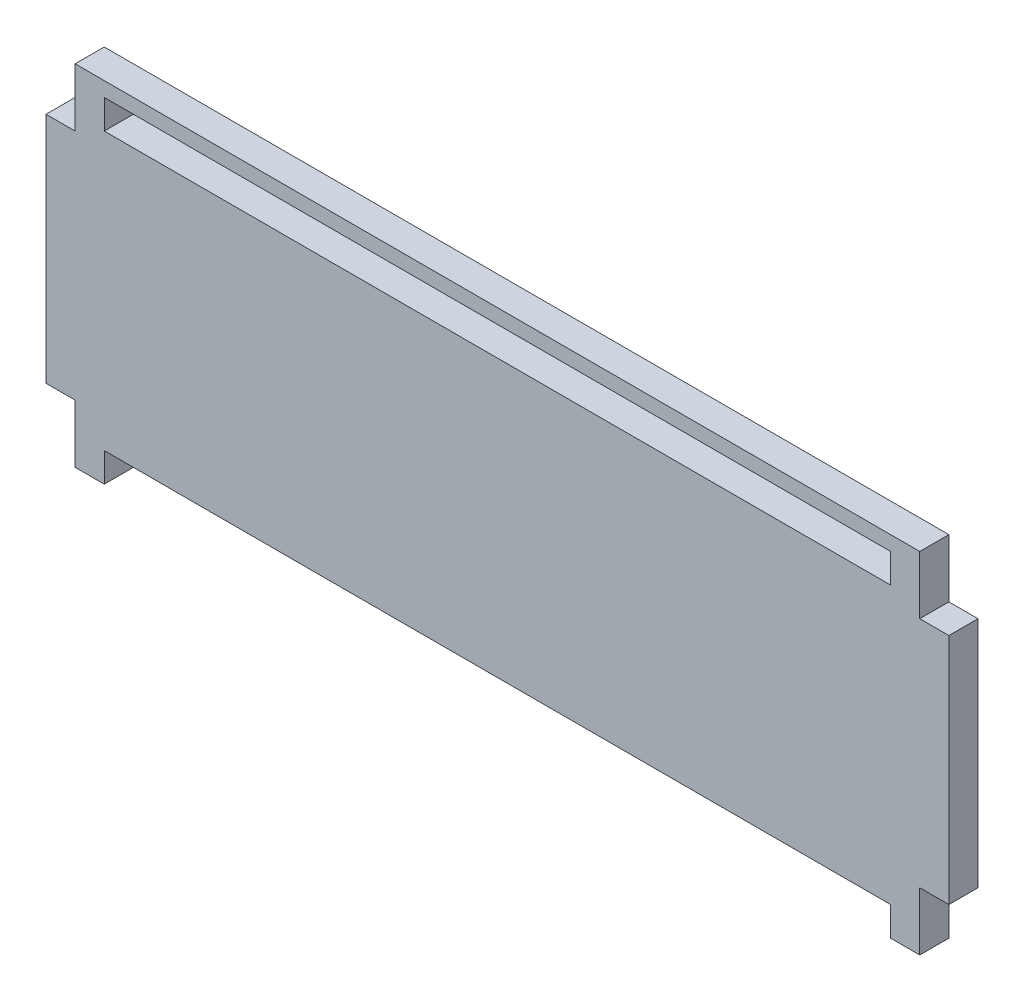
ISO-10303-21;
HEADER;
FILE_DESCRIPTION(('STEP AP214'),'2;1');
FILE_NAME('part.step','',(''),(''),'','','');
FILE_SCHEMA(('AUTOMOTIVE_DESIGN { 1 0 10303 214 1 1 1 1 }'));
ENDSEC;
DATA;
#1=APPLICATION_CONTEXT('core data for automotive mechanical design processes');
#2=APPLICATION_PROTOCOL_DEFINITION('international standard','automotive_design',2000,#1);
#3=PRODUCT_CONTEXT('',#1,'mechanical');
#4=PRODUCT('Part','Part','',(#3));
#5=PRODUCT_RELATED_PRODUCT_CATEGORY('part','',(#4));
#6=PRODUCT_DEFINITION_FORMATION('','',#4);
#7=PRODUCT_DEFINITION_CONTEXT('part definition',#1,'design');
#8=PRODUCT_DEFINITION('design','',#6,#7);
#9=PRODUCT_DEFINITION_SHAPE('','',#8);
#10=(LENGTH_UNIT() NAMED_UNIT(*) SI_UNIT(.MILLI.,.METRE.));
#11=(NAMED_UNIT(*) PLANE_ANGLE_UNIT() SI_UNIT($,.RADIAN.));
#12=(NAMED_UNIT(*) SI_UNIT($,.STERADIAN.) SOLID_ANGLE_UNIT());
#13=UNCERTAINTY_MEASURE_WITH_UNIT(LENGTH_MEASURE(1.E-05),#10,'distance_accuracy_value','');
#14=(GEOMETRIC_REPRESENTATION_CONTEXT(3) GLOBAL_UNCERTAINTY_ASSIGNED_CONTEXT((#13)) GLOBAL_UNIT_ASSIGNED_CONTEXT((#10,
#11,#12)) REPRESENTATION_CONTEXT('',''));
#15=CARTESIAN_POINT('',(0.,0.,0.));
#16=DIRECTION('',(0.,0.,1.));
#17=DIRECTION('',(1.,0.,0.));
#18=AXIS2_PLACEMENT_3D('',#15,#16,#17);
#19=CARTESIAN_POINT('',(114.3,-38.1,6.35));
#20=DIRECTION('',(0.,1.,0.));
#21=DIRECTION('',(-1.,0.,0.));
#22=AXIS2_PLACEMENT_3D('',#19,#20,#21);
#23=PLANE('',#22);
#24=DIRECTION('',(1.,0.,0.));
#25=VECTOR('',#24,1.);
#26=CARTESIAN_POINT('',(114.3,-38.1,0.));
#27=LINE('',#26,#25);
#28=CARTESIAN_POINT('',(-76.2,-38.1,0.));
#29=VERTEX_POINT('',#28);
#30=CARTESIAN_POINT('',(-69.85,-38.1,0.));
#31=VERTEX_POINT('',#30);
#32=EDGE_CURVE('E38',#29,#31,#27,.T.);
#33=ORIENTED_EDGE('',*,*,#32,.T.);
#34=DIRECTION('',(0.,0.,1.));
#35=VECTOR('',#34,1.);
#36=CARTESIAN_POINT('',(-69.85,-38.1,0.));
#37=LINE('',#36,#35);
#38=CARTESIAN_POINT('',(-69.85,-38.1,6.35));
#39=VERTEX_POINT('',#38);
#40=EDGE_CURVE('E174',#31,#39,#37,.T.);
#41=ORIENTED_EDGE('',*,*,#40,.T.);
#42=DIRECTION('',(1.,0.,0.));
#43=VECTOR('',#42,1.);
#44=CARTESIAN_POINT('',(114.3,-38.1,6.35));
#45=LINE('',#44,#43);
#46=CARTESIAN_POINT('',(-76.2,-38.1,6.35));
#47=VERTEX_POINT('',#46);
#48=EDGE_CURVE('E12',#47,#39,#45,.T.);
#49=ORIENTED_EDGE('',*,*,#48,.F.);
#50=DIRECTION('',(0.,0.,1.));
#51=VECTOR('',#50,1.);
#52=CARTESIAN_POINT('',(-76.2,-38.1,0.));
#53=LINE('',#52,#51);
#54=EDGE_CURVE('E195',#29,#47,#53,.T.);
#55=ORIENTED_EDGE('',*,*,#54,.F.);
#56=EDGE_LOOP('',(#33,#41,#49,#55));
#57=FACE_BOUND('',#56,.T.);
#58=ADVANCED_FACE('F34',(#57),#23,.F.);
#59=CARTESIAN_POINT('',(114.3,38.1,6.35));
#60=DIRECTION('',(-1.,0.,0.));
#61=DIRECTION('',(0.,-1.,0.));
#62=AXIS2_PLACEMENT_3D('',#59,#60,#61);
#63=PLANE('',#62);
#64=DIRECTION('',(0.,1.,0.));
#65=VECTOR('',#64,1.);
#66=CARTESIAN_POINT('',(114.3,38.1,6.35));
#67=LINE('',#66,#65);
#68=CARTESIAN_POINT('',(114.3,-25.4,6.35));
#69=VERTEX_POINT('',#68);
#70=CARTESIAN_POINT('',(114.3,25.4,6.35));
#71=VERTEX_POINT('',#70);
#72=EDGE_CURVE('E196',#69,#71,#67,.T.);
#73=ORIENTED_EDGE('',*,*,#72,.F.);
#74=DIRECTION('',(0.,0.,1.));
#75=VECTOR('',#74,1.);
#76=CARTESIAN_POINT('',(114.3,-25.4,0.));
#77=LINE('',#76,#75);
#78=CARTESIAN_POINT('',(114.3,-25.4,0.));
#79=VERTEX_POINT('',#78);
#80=EDGE_CURVE('E305',#79,#69,#77,.T.);
#81=ORIENTED_EDGE('',*,*,#80,.F.);
#82=DIRECTION('',(0.,1.,0.));
#83=VECTOR('',#82,1.);
#84=CARTESIAN_POINT('',(114.3,38.1,0.));
#85=LINE('',#84,#83);
#86=CARTESIAN_POINT('',(114.3,25.4,0.));
#87=VERTEX_POINT('',#86);
#88=EDGE_CURVE('E211',#79,#87,#85,.T.);
#89=ORIENTED_EDGE('',*,*,#88,.T.);
#90=DIRECTION('',(0.,0.,1.));
#91=VECTOR('',#90,1.);
#92=CARTESIAN_POINT('',(114.3,25.4,0.));
#93=LINE('',#92,#91);
#94=EDGE_CURVE('E275',#87,#71,#93,.T.);
#95=ORIENTED_EDGE('',*,*,#94,.T.);
#96=EDGE_LOOP('',(#73,#81,#89,#95));
#97=FACE_BOUND('',#96,.T.);
#98=ADVANCED_FACE('F36',(#97),#63,.F.);
#99=CARTESIAN_POINT('',(114.3,38.1,6.35));
#100=DIRECTION('',(0.,-1.,0.));
#101=DIRECTION('',(1.,0.,0.));
#102=AXIS2_PLACEMENT_3D('',#99,#100,#101);
#103=PLANE('',#102);
#104=DIRECTION('',(-1.,0.,0.));
#105=VECTOR('',#104,1.);
#106=CARTESIAN_POINT('',(114.3,38.1,6.35));
#107=LINE('',#106,#105);
#108=CARTESIAN_POINT('',(107.95,38.1,6.35));
#109=VERTEX_POINT('',#108);
#110=CARTESIAN_POINT('',(-76.2,38.1,6.35));
#111=VERTEX_POINT('',#110);
#112=EDGE_CURVE('E198',#109,#111,#107,.T.);
#113=ORIENTED_EDGE('',*,*,#112,.F.);
#114=DIRECTION('',(0.,0.,1.));
#115=VECTOR('',#114,1.);
#116=CARTESIAN_POINT('',(107.95,38.1,0.));
#117=LINE('',#116,#115);
#118=CARTESIAN_POINT('',(107.95,38.1,0.));
#119=VERTEX_POINT('',#118);
#120=EDGE_CURVE('E286',#119,#109,#117,.T.);
#121=ORIENTED_EDGE('',*,*,#120,.F.);
#122=DIRECTION('',(-1.,0.,0.));
#123=VECTOR('',#122,1.);
#124=CARTESIAN_POINT('',(114.3,38.1,0.));
#125=LINE('',#124,#123);
#126=CARTESIAN_POINT('',(-76.2,38.1,0.));
#127=VERTEX_POINT('',#126);
#128=EDGE_CURVE('E206',#119,#127,#125,.T.);
#129=ORIENTED_EDGE('',*,*,#128,.T.);
#130=DIRECTION('',(0.,0.,1.));
#131=VECTOR('',#130,1.);
#132=CARTESIAN_POINT('',(-76.2,38.1,0.));
#133=LINE('',#132,#131);
#134=EDGE_CURVE('E214',#127,#111,#133,.T.);
#135=ORIENTED_EDGE('',*,*,#134,.T.);
#136=EDGE_LOOP('',(#113,#121,#129,#135));
#137=FACE_BOUND('',#136,.T.);
#138=ADVANCED_FACE('F361',(#137),#103,.F.);
#139=CARTESIAN_POINT('',(-82.55,38.1,6.35));
#140=DIRECTION('',(1.,0.,0.));
#141=DIRECTION('',(0.,0.,-1.));
#142=AXIS2_PLACEMENT_3D('',#139,#140,#141);
#143=PLANE('',#142);
#144=DIRECTION('',(0.,-1.,0.));
#145=VECTOR('',#144,1.);
#146=CARTESIAN_POINT('',(-82.55,38.1,0.));
#147=LINE('',#146,#145);
#148=CARTESIAN_POINT('',(-82.55,25.4,0.));
#149=VERTEX_POINT('',#148);
#150=CARTESIAN_POINT('',(-82.55,-25.4,0.));
#151=VERTEX_POINT('',#150);
#152=EDGE_CURVE('E200',#149,#151,#147,.T.);
#153=ORIENTED_EDGE('',*,*,#152,.T.);
#154=DIRECTION('',(0.,0.,1.));
#155=VECTOR('',#154,1.);
#156=CARTESIAN_POINT('',(-82.55,-25.4,0.));
#157=LINE('',#156,#155);
#158=CARTESIAN_POINT('',(-82.55,-25.4,6.35));
#159=VERTEX_POINT('',#158);
#160=EDGE_CURVE('E234',#151,#159,#157,.T.);
#161=ORIENTED_EDGE('',*,*,#160,.T.);
#162=DIRECTION('',(0.,-1.,0.));
#163=VECTOR('',#162,1.);
#164=CARTESIAN_POINT('',(-82.55,38.1,6.35));
#165=LINE('',#164,#163);
#166=CARTESIAN_POINT('',(-82.55,25.4,6.35));
#167=VERTEX_POINT('',#166);
#168=EDGE_CURVE('E216',#167,#159,#165,.T.);
#169=ORIENTED_EDGE('',*,*,#168,.F.);
#170=DIRECTION('',(0.,0.,1.));
#171=VECTOR('',#170,1.);
#172=CARTESIAN_POINT('',(-82.55,25.4,0.));
#173=LINE('',#172,#171);
#174=EDGE_CURVE('E220',#149,#167,#173,.T.);
#175=ORIENTED_EDGE('',*,*,#174,.F.);
#176=EDGE_LOOP('',(#153,#161,#169,#175));
#177=FACE_BOUND('',#176,.T.);
#178=ADVANCED_FACE('F372',(#177),#143,.F.);
#179=CARTESIAN_POINT('',(101.6,-38.1,6.35));
#180=VERTEX_POINT('',#179);
#181=CARTESIAN_POINT('',(107.95,-38.1,6.35));
#182=VERTEX_POINT('',#181);
#183=EDGE_CURVE('E43',#180,#182,#45,.T.);
#184=ORIENTED_EDGE('',*,*,#183,.F.);
#185=DIRECTION('',(0.,0.,1.));
#186=VECTOR('',#185,1.);
#187=CARTESIAN_POINT('',(101.6,-38.1,0.));
#188=LINE('',#187,#186);
#189=CARTESIAN_POINT('',(101.6,-38.1,0.));
#190=VERTEX_POINT('',#189);
#191=EDGE_CURVE('E183',#190,#180,#188,.T.);
#192=ORIENTED_EDGE('',*,*,#191,.F.);
#193=CARTESIAN_POINT('',(107.95,-38.1,0.));
#194=VERTEX_POINT('',#193);
#195=EDGE_CURVE('E197',#190,#194,#27,.T.);
#196=ORIENTED_EDGE('',*,*,#195,.T.);
#197=DIRECTION('',(0.,0.,1.));
#198=VECTOR('',#197,1.);
#199=CARTESIAN_POINT('',(107.95,-38.1,0.));
#200=LINE('',#199,#198);
#201=EDGE_CURVE('E300',#194,#182,#200,.T.);
#202=ORIENTED_EDGE('',*,*,#201,.T.);
#203=EDGE_LOOP('',(#184,#192,#196,#202));
#204=FACE_BOUND('',#203,.T.);
#205=ADVANCED_FACE('F336',(#204),#23,.F.);
#206=CARTESIAN_POINT('',(0.,0.,6.35));
#207=DIRECTION('',(0.,0.,-1.));
#208=DIRECTION('',(-1.,0.,0.));
#209=AXIS2_PLACEMENT_3D('',#206,#207,#208);
#210=PLANE('',#209);
#211=DIRECTION('',(-1.,0.,0.));
#212=VECTOR('',#211,1.);
#213=CARTESIAN_POINT('',(101.6,34.925,6.35));
#214=LINE('',#213,#212);
#215=CARTESIAN_POINT('',(101.6,34.925,6.35));
#216=VERTEX_POINT('',#215);
#217=CARTESIAN_POINT('',(-69.85,34.925,6.35));
#218=VERTEX_POINT('',#217);
#219=EDGE_CURVE('E270',#216,#218,#214,.T.);
#220=ORIENTED_EDGE('',*,*,#219,.F.);
#221=DIRECTION('',(0.,1.,0.));
#222=VECTOR('',#221,1.);
#223=CARTESIAN_POINT('',(101.6,28.575,6.35));
#224=LINE('',#223,#222);
#225=CARTESIAN_POINT('',(101.6,28.575,6.35));
#226=VERTEX_POINT('',#225);
#227=EDGE_CURVE('E273',#226,#216,#224,.T.);
#228=ORIENTED_EDGE('',*,*,#227,.F.);
#229=DIRECTION('',(1.,0.,0.));
#230=VECTOR('',#229,1.);
#231=CARTESIAN_POINT('',(-69.85,28.575,6.35));
#232=LINE('',#231,#230);
#233=CARTESIAN_POINT('',(-69.85,28.575,6.35));
#234=VERTEX_POINT('',#233);
#235=EDGE_CURVE('E263',#234,#226,#232,.T.);
#236=ORIENTED_EDGE('',*,*,#235,.F.);
#237=DIRECTION('',(0.,-1.,0.));
#238=VECTOR('',#237,1.);
#239=CARTESIAN_POINT('',(-69.85,34.925,6.35));
#240=LINE('',#239,#238);
#241=EDGE_CURVE('E267',#218,#234,#240,.T.);
#242=ORIENTED_EDGE('',*,*,#241,.F.);
#243=EDGE_LOOP('',(#220,#228,#236,#242));
#244=FACE_BOUND('',#243,.T.);
#245=ORIENTED_EDGE('',*,*,#48,.T.);
#246=DIRECTION('',(0.,-1.,0.));
#247=VECTOR('',#246,1.);
#248=CARTESIAN_POINT('',(-69.85,-31.75,6.35));
#249=LINE('',#248,#247);
#250=CARTESIAN_POINT('',(-69.85,-31.75,6.35));
#251=VERTEX_POINT('',#250);
#252=EDGE_CURVE('E179',#251,#39,#249,.T.);
#253=ORIENTED_EDGE('',*,*,#252,.F.);
#254=DIRECTION('',(-1.,0.,0.));
#255=VECTOR('',#254,1.);
#256=CARTESIAN_POINT('',(-69.85,-31.75,6.35));
#257=LINE('',#256,#255);
#258=CARTESIAN_POINT('',(101.6,-31.75,6.35));
#259=VERTEX_POINT('',#258);
#260=EDGE_CURVE('E192',#259,#251,#257,.T.);
#261=ORIENTED_EDGE('',*,*,#260,.F.);
#262=DIRECTION('',(0.,1.,0.));
#263=VECTOR('',#262,1.);
#264=CARTESIAN_POINT('',(101.6,-31.75,6.35));
#265=LINE('',#264,#263);
#266=EDGE_CURVE('E327',#180,#259,#265,.T.);
#267=ORIENTED_EDGE('',*,*,#266,.F.);
#268=ORIENTED_EDGE('',*,*,#183,.T.);
#269=DIRECTION('',(0.,-1.,0.));
#270=VECTOR('',#269,1.);
#271=CARTESIAN_POINT('',(107.95,-38.1,6.35));
#272=LINE('',#271,#270);
#273=CARTESIAN_POINT('',(107.95,-25.4,6.35));
#274=VERTEX_POINT('',#273);
#275=EDGE_CURVE('E310',#274,#182,#272,.T.);
#276=ORIENTED_EDGE('',*,*,#275,.F.);
#277=DIRECTION('',(-1.,0.,0.));
#278=VECTOR('',#277,1.);
#279=CARTESIAN_POINT('',(114.3,-25.4,6.35));
#280=LINE('',#279,#278);
#281=EDGE_CURVE('E314',#69,#274,#280,.T.);
#282=ORIENTED_EDGE('',*,*,#281,.F.);
#283=ORIENTED_EDGE('',*,*,#72,.T.);
#284=DIRECTION('',(1.,0.,0.));
#285=VECTOR('',#284,1.);
#286=CARTESIAN_POINT('',(114.3,25.4,6.35));
#287=LINE('',#286,#285);
#288=CARTESIAN_POINT('',(107.95,25.4,6.35));
#289=VERTEX_POINT('',#288);
#290=EDGE_CURVE('E293',#289,#71,#287,.T.);
#291=ORIENTED_EDGE('',*,*,#290,.F.);
#292=DIRECTION('',(0.,-1.,0.));
#293=VECTOR('',#292,1.);
#294=CARTESIAN_POINT('',(107.95,38.1,6.35));
#295=LINE('',#294,#293);
#296=EDGE_CURVE('E297',#109,#289,#295,.T.);
#297=ORIENTED_EDGE('',*,*,#296,.F.);
#298=ORIENTED_EDGE('',*,*,#112,.T.);
#299=DIRECTION('',(0.,1.,0.));
#300=VECTOR('',#299,1.);
#301=CARTESIAN_POINT('',(-76.2,38.1,6.35));
#302=LINE('',#301,#300);
#303=CARTESIAN_POINT('',(-76.2,25.4,6.35));
#304=VERTEX_POINT('',#303);
#305=EDGE_CURVE('E227',#304,#111,#302,.T.);
#306=ORIENTED_EDGE('',*,*,#305,.F.);
#307=DIRECTION('',(1.,0.,0.));
#308=VECTOR('',#307,1.);
#309=CARTESIAN_POINT('',(-82.55,25.4,6.35));
#310=LINE('',#309,#308);
#311=EDGE_CURVE('E231',#167,#304,#310,.T.);
#312=ORIENTED_EDGE('',*,*,#311,.F.);
#313=ORIENTED_EDGE('',*,*,#168,.T.);
#314=DIRECTION('',(-1.,0.,0.));
#315=VECTOR('',#314,1.);
#316=CARTESIAN_POINT('',(-82.55,-25.4,6.35));
#317=LINE('',#316,#315);
#318=CARTESIAN_POINT('',(-76.2,-25.4,6.35));
#319=VERTEX_POINT('',#318);
#320=EDGE_CURVE('E244',#319,#159,#317,.T.);
#321=ORIENTED_EDGE('',*,*,#320,.F.);
#322=DIRECTION('',(0.,1.,0.));
#323=VECTOR('',#322,1.);
#324=CARTESIAN_POINT('',(-76.2,-38.1,6.35));
#325=LINE('',#324,#323);
#326=EDGE_CURVE('E247',#47,#319,#325,.T.);
#327=ORIENTED_EDGE('',*,*,#326,.F.);
#328=EDGE_LOOP('',(#245,#253,#261,#267,#268,#276,#282,#283,#291,#297,#298,#306,#312,#313,#321,#327));
#329=FACE_BOUND('',#328,.T.);
#330=ADVANCED_FACE('F339',(#244,#329),#210,.F.);
#331=CARTESIAN_POINT('',(0.,0.,0.));
#332=DIRECTION('',(0.,0.,-1.));
#333=DIRECTION('',(-1.,0.,0.));
#334=AXIS2_PLACEMENT_3D('',#331,#332,#333);
#335=PLANE('',#334);
#336=DIRECTION('',(0.,-1.,0.));
#337=VECTOR('',#336,1.);
#338=CARTESIAN_POINT('',(-69.85,-31.75,0.));
#339=LINE('',#338,#337);
#340=CARTESIAN_POINT('',(-69.85,-31.75,0.));
#341=VERTEX_POINT('',#340);
#342=EDGE_CURVE('E177',#341,#31,#339,.T.);
#343=ORIENTED_EDGE('',*,*,#342,.T.);
#344=ORIENTED_EDGE('',*,*,#32,.F.);
#345=DIRECTION('',(0.,1.,0.));
#346=VECTOR('',#345,1.);
#347=CARTESIAN_POINT('',(-76.2,-38.1,0.));
#348=LINE('',#347,#346);
#349=CARTESIAN_POINT('',(-76.2,-25.4,0.));
#350=VERTEX_POINT('',#349);
#351=EDGE_CURVE('E246',#29,#350,#348,.T.);
#352=ORIENTED_EDGE('',*,*,#351,.T.);
#353=DIRECTION('',(-1.,0.,0.));
#354=VECTOR('',#353,1.);
#355=CARTESIAN_POINT('',(-82.55,-25.4,0.));
#356=LINE('',#355,#354);
#357=EDGE_CURVE('E241',#350,#151,#356,.T.);
#358=ORIENTED_EDGE('',*,*,#357,.T.);
#359=ORIENTED_EDGE('',*,*,#152,.F.);
#360=DIRECTION('',(1.,0.,0.));
#361=VECTOR('',#360,1.);
#362=CARTESIAN_POINT('',(-82.55,25.4,0.));
#363=LINE('',#362,#361);
#364=CARTESIAN_POINT('',(-76.2,25.4,0.));
#365=VERTEX_POINT('',#364);
#366=EDGE_CURVE('E230',#149,#365,#363,.T.);
#367=ORIENTED_EDGE('',*,*,#366,.T.);
#368=DIRECTION('',(0.,1.,0.));
#369=VECTOR('',#368,1.);
#370=CARTESIAN_POINT('',(-76.2,38.1,0.));
#371=LINE('',#370,#369);
#372=EDGE_CURVE('E223',#365,#127,#371,.T.);
#373=ORIENTED_EDGE('',*,*,#372,.T.);
#374=ORIENTED_EDGE('',*,*,#128,.F.);
#375=DIRECTION('',(0.,-1.,0.));
#376=VECTOR('',#375,1.);
#377=CARTESIAN_POINT('',(107.95,38.1,0.));
#378=LINE('',#377,#376);
#379=CARTESIAN_POINT('',(107.95,25.4,0.));
#380=VERTEX_POINT('',#379);
#381=EDGE_CURVE('E296',#119,#380,#378,.T.);
#382=ORIENTED_EDGE('',*,*,#381,.T.);
#383=DIRECTION('',(1.,0.,0.));
#384=VECTOR('',#383,1.);
#385=CARTESIAN_POINT('',(114.3,25.4,0.));
#386=LINE('',#385,#384);
#387=EDGE_CURVE('E289',#380,#87,#386,.T.);
#388=ORIENTED_EDGE('',*,*,#387,.T.);
#389=ORIENTED_EDGE('',*,*,#88,.F.);
#390=DIRECTION('',(-1.,0.,0.));
#391=VECTOR('',#390,1.);
#392=CARTESIAN_POINT('',(114.3,-25.4,0.));
#393=LINE('',#392,#391);
#394=CARTESIAN_POINT('',(107.95,-25.4,0.));
#395=VERTEX_POINT('',#394);
#396=EDGE_CURVE('E313',#79,#395,#393,.T.);
#397=ORIENTED_EDGE('',*,*,#396,.T.);
#398=DIRECTION('',(0.,-1.,0.));
#399=VECTOR('',#398,1.);
#400=CARTESIAN_POINT('',(107.95,-38.1,0.));
#401=LINE('',#400,#399);
#402=EDGE_CURVE('E59',#395,#194,#401,.T.);
#403=ORIENTED_EDGE('',*,*,#402,.T.);
#404=ORIENTED_EDGE('',*,*,#195,.F.);
#405=DIRECTION('',(0.,1.,0.));
#406=VECTOR('',#405,1.);
#407=CARTESIAN_POINT('',(101.6,-31.75,0.));
#408=LINE('',#407,#406);
#409=CARTESIAN_POINT('',(101.6,-31.75,0.));
#410=VERTEX_POINT('',#409);
#411=EDGE_CURVE('E191',#190,#410,#408,.T.);
#412=ORIENTED_EDGE('',*,*,#411,.T.);
#413=DIRECTION('',(-1.,0.,0.));
#414=VECTOR('',#413,1.);
#415=CARTESIAN_POINT('',(-69.85,-31.75,0.));
#416=LINE('',#415,#414);
#417=EDGE_CURVE('E51',#410,#341,#416,.T.);
#418=ORIENTED_EDGE('',*,*,#417,.T.);
#419=EDGE_LOOP('',(#343,#344,#352,#358,#359,#367,#373,#374,#382,#388,#389,#397,#403,#404,#412,#418));
#420=FACE_BOUND('',#419,.T.);
#421=DIRECTION('',(0.,1.,0.));
#422=VECTOR('',#421,1.);
#423=CARTESIAN_POINT('',(101.6,28.575,0.));
#424=LINE('',#423,#422);
#425=CARTESIAN_POINT('',(101.6,28.575,0.));
#426=VERTEX_POINT('',#425);
#427=CARTESIAN_POINT('',(101.6,34.925,0.));
#428=VERTEX_POINT('',#427);
#429=EDGE_CURVE('E266',#426,#428,#424,.T.);
#430=ORIENTED_EDGE('',*,*,#429,.T.);
#431=DIRECTION('',(-1.,0.,0.));
#432=VECTOR('',#431,1.);
#433=CARTESIAN_POINT('',(101.6,34.925,0.));
#434=LINE('',#433,#432);
#435=CARTESIAN_POINT('',(-69.85,34.925,0.));
#436=VERTEX_POINT('',#435);
#437=EDGE_CURVE('E281',#428,#436,#434,.T.);
#438=ORIENTED_EDGE('',*,*,#437,.T.);
#439=DIRECTION('',(0.,-1.,0.));
#440=VECTOR('',#439,1.);
#441=CARTESIAN_POINT('',(-69.85,34.925,0.));
#442=LINE('',#441,#440);
#443=CARTESIAN_POINT('',(-69.85,28.575,0.));
#444=VERTEX_POINT('',#443);
#445=EDGE_CURVE('E278',#436,#444,#442,.T.);
#446=ORIENTED_EDGE('',*,*,#445,.T.);
#447=DIRECTION('',(1.,0.,0.));
#448=VECTOR('',#447,1.);
#449=CARTESIAN_POINT('',(-69.85,28.575,0.));
#450=LINE('',#449,#448);
#451=EDGE_CURVE('E258',#444,#426,#450,.T.);
#452=ORIENTED_EDGE('',*,*,#451,.T.);
#453=EDGE_LOOP('',(#430,#438,#446,#452));
#454=FACE_BOUND('',#453,.T.);
#455=ADVANCED_FACE('F187',(#420,#454),#335,.T.);
#456=CARTESIAN_POINT('',(-76.2,38.1,0.));
#457=DIRECTION('',(1.,0.,0.));
#458=DIRECTION('',(0.,1.,0.));
#459=AXIS2_PLACEMENT_3D('',#456,#457,#458);
#460=PLANE('',#459);
#461=ORIENTED_EDGE('',*,*,#305,.T.);
#462=ORIENTED_EDGE('',*,*,#134,.F.);
#463=ORIENTED_EDGE('',*,*,#372,.F.);
#464=DIRECTION('',(0.,0.,1.));
#465=VECTOR('',#464,1.);
#466=CARTESIAN_POINT('',(-76.2,25.4,0.));
#467=LINE('',#466,#465);
#468=EDGE_CURVE('E222',#365,#304,#467,.T.);
#469=ORIENTED_EDGE('',*,*,#468,.T.);
#470=EDGE_LOOP('',(#461,#462,#463,#469));
#471=FACE_BOUND('',#470,.T.);
#472=ADVANCED_FACE('F366',(#471),#460,.F.);
#473=CARTESIAN_POINT('',(-82.55,25.4,0.));
#474=DIRECTION('',(0.,-1.,0.));
#475=DIRECTION('',(1.,0.,0.));
#476=AXIS2_PLACEMENT_3D('',#473,#474,#475);
#477=PLANE('',#476);
#478=ORIENTED_EDGE('',*,*,#311,.T.);
#479=ORIENTED_EDGE('',*,*,#468,.F.);
#480=ORIENTED_EDGE('',*,*,#366,.F.);
#481=ORIENTED_EDGE('',*,*,#174,.T.);
#482=EDGE_LOOP('',(#478,#479,#480,#481));
#483=FACE_BOUND('',#482,.T.);
#484=ADVANCED_FACE('F369',(#483),#477,.F.);
#485=CARTESIAN_POINT('',(-82.55,-25.4,0.));
#486=DIRECTION('',(0.,1.,0.));
#487=DIRECTION('',(0.,0.,1.));
#488=AXIS2_PLACEMENT_3D('',#485,#486,#487);
#489=PLANE('',#488);
#490=ORIENTED_EDGE('',*,*,#320,.T.);
#491=ORIENTED_EDGE('',*,*,#160,.F.);
#492=ORIENTED_EDGE('',*,*,#357,.F.);
#493=DIRECTION('',(0.,0.,1.));
#494=VECTOR('',#493,1.);
#495=CARTESIAN_POINT('',(-76.2,-25.4,0.));
#496=LINE('',#495,#494);
#497=EDGE_CURVE('E240',#350,#319,#496,.T.);
#498=ORIENTED_EDGE('',*,*,#497,.T.);
#499=EDGE_LOOP('',(#490,#491,#492,#498));
#500=FACE_BOUND('',#499,.T.);
#501=ADVANCED_FACE('F374',(#500),#489,.F.);
#502=CARTESIAN_POINT('',(-76.2,-38.1,0.));
#503=DIRECTION('',(1.,0.,0.));
#504=DIRECTION('',(0.,0.,-1.));
#505=AXIS2_PLACEMENT_3D('',#502,#503,#504);
#506=PLANE('',#505);
#507=ORIENTED_EDGE('',*,*,#326,.T.);
#508=ORIENTED_EDGE('',*,*,#497,.F.);
#509=ORIENTED_EDGE('',*,*,#351,.F.);
#510=ORIENTED_EDGE('',*,*,#54,.T.);
#511=EDGE_LOOP('',(#507,#508,#509,#510));
#512=FACE_BOUND('',#511,.T.);
#513=ADVANCED_FACE('F377',(#512),#506,.F.);
#514=CARTESIAN_POINT('',(101.6,28.575,0.));
#515=DIRECTION('',(1.,0.,0.));
#516=DIRECTION('',(0.,0.,-1.));
#517=AXIS2_PLACEMENT_3D('',#514,#515,#516);
#518=PLANE('',#517);
#519=ORIENTED_EDGE('',*,*,#227,.T.);
#520=DIRECTION('',(0.,0.,1.));
#521=VECTOR('',#520,1.);
#522=CARTESIAN_POINT('',(101.6,34.925,0.));
#523=LINE('',#522,#521);
#524=EDGE_CURVE('E254',#428,#216,#523,.T.);
#525=ORIENTED_EDGE('',*,*,#524,.F.);
#526=ORIENTED_EDGE('',*,*,#429,.F.);
#527=DIRECTION('',(0.,0.,1.));
#528=VECTOR('',#527,1.);
#529=CARTESIAN_POINT('',(101.6,28.575,0.));
#530=LINE('',#529,#528);
#531=EDGE_CURVE('E250',#426,#226,#530,.T.);
#532=ORIENTED_EDGE('',*,*,#531,.T.);
#533=EDGE_LOOP('',(#519,#525,#526,#532));
#534=FACE_BOUND('',#533,.T.);
#535=ADVANCED_FACE('F451',(#534),#518,.F.);
#536=CARTESIAN_POINT('',(-69.85,28.575,0.));
#537=DIRECTION('',(0.,-1.,0.));
#538=DIRECTION('',(0.,0.,-1.));
#539=AXIS2_PLACEMENT_3D('',#536,#537,#538);
#540=PLANE('',#539);
#541=ORIENTED_EDGE('',*,*,#235,.T.);
#542=ORIENTED_EDGE('',*,*,#531,.F.);
#543=ORIENTED_EDGE('',*,*,#451,.F.);
#544=DIRECTION('',(0.,0.,1.));
#545=VECTOR('',#544,1.);
#546=CARTESIAN_POINT('',(-69.85,28.575,0.));
#547=LINE('',#546,#545);
#548=EDGE_CURVE('E260',#444,#234,#547,.T.);
#549=ORIENTED_EDGE('',*,*,#548,.T.);
#550=EDGE_LOOP('',(#541,#542,#543,#549));
#551=FACE_BOUND('',#550,.T.);
#552=ADVANCED_FACE('F459',(#551),#540,.F.);
#553=CARTESIAN_POINT('',(-69.85,34.925,0.));
#554=DIRECTION('',(-1.,0.,0.));
#555=DIRECTION('',(0.,0.,1.));
#556=AXIS2_PLACEMENT_3D('',#553,#554,#555);
#557=PLANE('',#556);
#558=ORIENTED_EDGE('',*,*,#241,.T.);
#559=ORIENTED_EDGE('',*,*,#548,.F.);
#560=ORIENTED_EDGE('',*,*,#445,.F.);
#561=DIRECTION('',(0.,0.,1.));
#562=VECTOR('',#561,1.);
#563=CARTESIAN_POINT('',(-69.85,34.925,0.));
#564=LINE('',#563,#562);
#565=EDGE_CURVE('E257',#436,#218,#564,.T.);
#566=ORIENTED_EDGE('',*,*,#565,.T.);
#567=EDGE_LOOP('',(#558,#559,#560,#566));
#568=FACE_BOUND('',#567,.T.);
#569=ADVANCED_FACE('F468',(#568),#557,.F.);
#570=CARTESIAN_POINT('',(101.6,34.925,0.));
#571=DIRECTION('',(0.,1.,0.));
#572=DIRECTION('',(0.,0.,1.));
#573=AXIS2_PLACEMENT_3D('',#570,#571,#572);
#574=PLANE('',#573);
#575=ORIENTED_EDGE('',*,*,#219,.T.);
#576=ORIENTED_EDGE('',*,*,#565,.F.);
#577=ORIENTED_EDGE('',*,*,#437,.F.);
#578=ORIENTED_EDGE('',*,*,#524,.T.);
#579=EDGE_LOOP('',(#575,#576,#577,#578));
#580=FACE_BOUND('',#579,.T.);
#581=ADVANCED_FACE('F477',(#580),#574,.F.);
#582=CARTESIAN_POINT('',(114.3,25.4,0.));
#583=DIRECTION('',(0.,-1.,0.));
#584=DIRECTION('',(0.,0.,-1.));
#585=AXIS2_PLACEMENT_3D('',#582,#583,#584);
#586=PLANE('',#585);
#587=ORIENTED_EDGE('',*,*,#290,.T.);
#588=ORIENTED_EDGE('',*,*,#94,.F.);
#589=ORIENTED_EDGE('',*,*,#387,.F.);
#590=DIRECTION('',(0.,0.,1.));
#591=VECTOR('',#590,1.);
#592=CARTESIAN_POINT('',(107.95,25.4,0.));
#593=LINE('',#592,#591);
#594=EDGE_CURVE('E288',#380,#289,#593,.T.);
#595=ORIENTED_EDGE('',*,*,#594,.T.);
#596=EDGE_LOOP('',(#587,#588,#589,#595));
#597=FACE_BOUND('',#596,.T.);
#598=ADVANCED_FACE('F352',(#597),#586,.F.);
#599=CARTESIAN_POINT('',(107.95,38.1,0.));
#600=DIRECTION('',(-1.,0.,0.));
#601=DIRECTION('',(0.,0.,1.));
#602=AXIS2_PLACEMENT_3D('',#599,#600,#601);
#603=PLANE('',#602);
#604=ORIENTED_EDGE('',*,*,#296,.T.);
#605=ORIENTED_EDGE('',*,*,#594,.F.);
#606=ORIENTED_EDGE('',*,*,#381,.F.);
#607=ORIENTED_EDGE('',*,*,#120,.T.);
#608=EDGE_LOOP('',(#604,#605,#606,#607));
#609=FACE_BOUND('',#608,.T.);
#610=ADVANCED_FACE('F357',(#609),#603,.F.);
#611=CARTESIAN_POINT('',(107.95,-38.1,0.));
#612=DIRECTION('',(-1.,0.,0.));
#613=DIRECTION('',(0.,0.,1.));
#614=AXIS2_PLACEMENT_3D('',#611,#612,#613);
#615=PLANE('',#614);
#616=ORIENTED_EDGE('',*,*,#275,.T.);
#617=ORIENTED_EDGE('',*,*,#201,.F.);
#618=ORIENTED_EDGE('',*,*,#402,.F.);
#619=DIRECTION('',(0.,0.,1.));
#620=VECTOR('',#619,1.);
#621=CARTESIAN_POINT('',(107.95,-25.4,0.));
#622=LINE('',#621,#620);
#623=EDGE_CURVE('E307',#395,#274,#622,.T.);
#624=ORIENTED_EDGE('',*,*,#623,.T.);
#625=EDGE_LOOP('',(#616,#617,#618,#624));
#626=FACE_BOUND('',#625,.T.);
#627=ADVANCED_FACE('F342',(#626),#615,.F.);
#628=CARTESIAN_POINT('',(114.3,-25.4,0.));
#629=DIRECTION('',(0.,1.,0.));
#630=DIRECTION('',(0.,0.,1.));
#631=AXIS2_PLACEMENT_3D('',#628,#629,#630);
#632=PLANE('',#631);
#633=ORIENTED_EDGE('',*,*,#281,.T.);
#634=ORIENTED_EDGE('',*,*,#623,.F.);
#635=ORIENTED_EDGE('',*,*,#396,.F.);
#636=ORIENTED_EDGE('',*,*,#80,.T.);
#637=EDGE_LOOP('',(#633,#634,#635,#636));
#638=FACE_BOUND('',#637,.T.);
#639=ADVANCED_FACE('F344',(#638),#632,.F.);
#640=CARTESIAN_POINT('',(-69.85,-31.75,0.));
#641=DIRECTION('',(-1.,0.,0.));
#642=DIRECTION('',(0.,0.,1.));
#643=AXIS2_PLACEMENT_3D('',#640,#641,#642);
#644=PLANE('',#643);
#645=ORIENTED_EDGE('',*,*,#252,.T.);
#646=ORIENTED_EDGE('',*,*,#40,.F.);
#647=ORIENTED_EDGE('',*,*,#342,.F.);
#648=DIRECTION('',(0.,0.,1.));
#649=VECTOR('',#648,1.);
#650=CARTESIAN_POINT('',(-69.85,-31.75,0.));
#651=LINE('',#650,#649);
#652=EDGE_CURVE('E317',#341,#251,#651,.T.);
#653=ORIENTED_EDGE('',*,*,#652,.T.);
#654=EDGE_LOOP('',(#645,#646,#647,#653));
#655=FACE_BOUND('',#654,.T.);
#656=ADVANCED_FACE('F176',(#655),#644,.F.);
#657=CARTESIAN_POINT('',(-69.85,-31.75,0.));
#658=DIRECTION('',(0.,1.,0.));
#659=DIRECTION('',(0.,0.,1.));
#660=AXIS2_PLACEMENT_3D('',#657,#658,#659);
#661=PLANE('',#660);
#662=ORIENTED_EDGE('',*,*,#260,.T.);
#663=ORIENTED_EDGE('',*,*,#652,.F.);
#664=ORIENTED_EDGE('',*,*,#417,.F.);
#665=DIRECTION('',(0.,0.,1.));
#666=VECTOR('',#665,1.);
#667=CARTESIAN_POINT('',(101.6,-31.75,0.));
#668=LINE('',#667,#666);
#669=EDGE_CURVE('E322',#410,#259,#668,.T.);
#670=ORIENTED_EDGE('',*,*,#669,.T.);
#671=EDGE_LOOP('',(#662,#663,#664,#670));
#672=FACE_BOUND('',#671,.T.);
#673=ADVANCED_FACE('F379',(#672),#661,.F.);
#674=CARTESIAN_POINT('',(101.6,-31.75,0.));
#675=DIRECTION('',(1.,0.,0.));
#676=DIRECTION('',(0.,0.,-1.));
#677=AXIS2_PLACEMENT_3D('',#674,#675,#676);
#678=PLANE('',#677);
#679=ORIENTED_EDGE('',*,*,#266,.T.);
#680=ORIENTED_EDGE('',*,*,#669,.F.);
#681=ORIENTED_EDGE('',*,*,#411,.F.);
#682=ORIENTED_EDGE('',*,*,#191,.T.);
#683=EDGE_LOOP('',(#679,#680,#681,#682));
#684=FACE_BOUND('',#683,.T.);
#685=ADVANCED_FACE('F333',(#684),#678,.F.);
#686=CLOSED_SHELL('',(#58,#98,#138,#178,#205,#330,#455,#472,#484,#501,#513,#535,#552,#569,#581,
#598,#610,#627,#639,#656,#673,#685));
#687=MANIFOLD_SOLID_BREP('B2',#686);
#688=ADVANCED_BREP_SHAPE_REPRESENTATION('',(#18,#687),#14);
#689=SHAPE_DEFINITION_REPRESENTATION(#9,#688);
ENDSEC;
END-ISO-10303-21;
